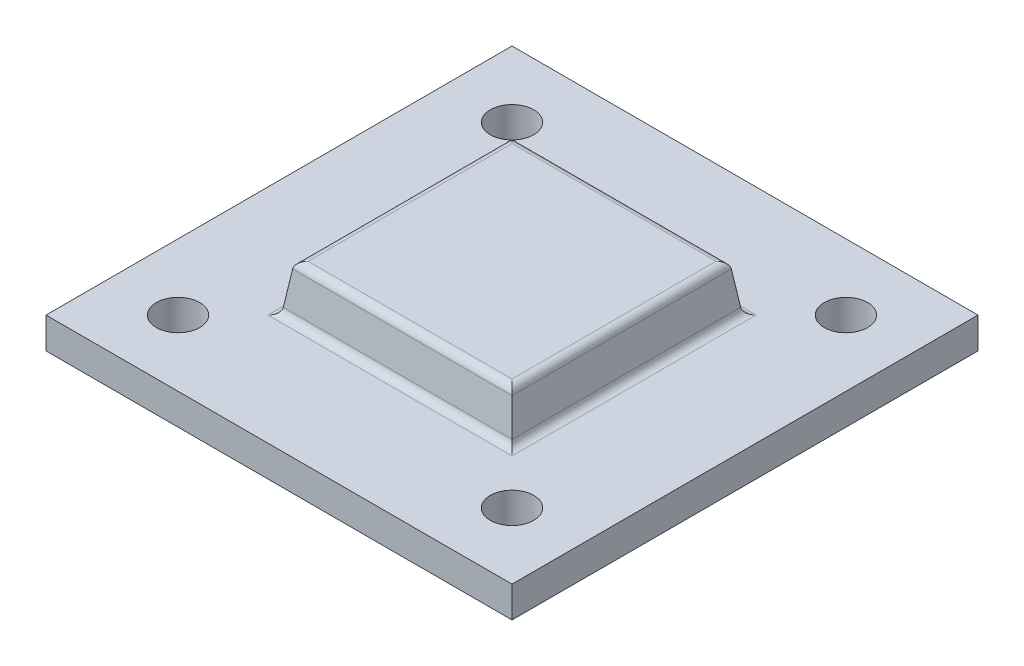
ISO-10303-21;
HEADER;
FILE_DESCRIPTION(('STEP AP214'),'2;1');
FILE_NAME('part.step','',(''),(''),'','','');
FILE_SCHEMA(('AUTOMOTIVE_DESIGN { 1 0 10303 214 1 1 1 1 }'));
ENDSEC;
DATA;
#1=APPLICATION_CONTEXT('core data for automotive mechanical design processes');
#2=APPLICATION_PROTOCOL_DEFINITION('international standard','automotive_design',2000,#1);
#3=PRODUCT_CONTEXT('',#1,'mechanical');
#4=PRODUCT('Part','Part','',(#3));
#5=PRODUCT_RELATED_PRODUCT_CATEGORY('part','',(#4));
#6=PRODUCT_DEFINITION_FORMATION('','',#4);
#7=PRODUCT_DEFINITION_CONTEXT('part definition',#1,'design');
#8=PRODUCT_DEFINITION('design','',#6,#7);
#9=PRODUCT_DEFINITION_SHAPE('','',#8);
#10=(LENGTH_UNIT() NAMED_UNIT(*) SI_UNIT(.MILLI.,.METRE.));
#11=(NAMED_UNIT(*) PLANE_ANGLE_UNIT() SI_UNIT($,.RADIAN.));
#12=(NAMED_UNIT(*) SI_UNIT($,.STERADIAN.) SOLID_ANGLE_UNIT());
#13=UNCERTAINTY_MEASURE_WITH_UNIT(LENGTH_MEASURE(1.E-05),#10,'distance_accuracy_value','');
#14=(GEOMETRIC_REPRESENTATION_CONTEXT(3) GLOBAL_UNCERTAINTY_ASSIGNED_CONTEXT((#13)) GLOBAL_UNIT_ASSIGNED_CONTEXT((#10,
#11,#12)) REPRESENTATION_CONTEXT('',''));
#15=CARTESIAN_POINT('',(0.,0.,0.));
#16=DIRECTION('',(0.,0.,1.));
#17=DIRECTION('',(1.,0.,0.));
#18=AXIS2_PLACEMENT_3D('',#15,#16,#17);
#19=CARTESIAN_POINT('',(0.,4.,0.));
#20=DIRECTION('',(0.,-1.,0.));
#21=DIRECTION('',(0.,0.,-1.));
#22=AXIS2_PLACEMENT_3D('',#19,#20,#21);
#23=PLANE('',#22);
#24=CARTESIAN_POINT('',(-21.5,4.,21.5));
#25=DIRECTION('',(0.,1.,0.));
#26=DIRECTION('',(0.,0.,-1.));
#27=AXIS2_PLACEMENT_3D('',#24,#25,#26);
#28=CIRCLE('',#27,2.794);
#29=CARTESIAN_POINT('',(-21.5,4.,18.706));
#30=VERTEX_POINT('',#29);
#31=EDGE_CURVE('E443',#30,#30,#28,.T.);
#32=ORIENTED_EDGE('',*,*,#31,.F.);
#33=EDGE_LOOP('',(#32));
#34=FACE_BOUND('',#33,.T.);
#35=CARTESIAN_POINT('',(21.5,4.,21.5));
#36=DIRECTION('',(0.,1.,0.));
#37=DIRECTION('',(0.,0.,1.));
#38=AXIS2_PLACEMENT_3D('',#35,#36,#37);
#39=CIRCLE('',#38,2.794);
#40=CARTESIAN_POINT('',(21.5,4.,24.294));
#41=VERTEX_POINT('',#40);
#42=EDGE_CURVE('E445',#41,#41,#39,.T.);
#43=ORIENTED_EDGE('',*,*,#42,.F.);
#44=EDGE_LOOP('',(#43));
#45=FACE_BOUND('',#44,.T.);
#46=CARTESIAN_POINT('',(21.5,4.,-21.5));
#47=DIRECTION('',(0.,1.,0.));
#48=DIRECTION('',(0.,0.,-1.));
#49=AXIS2_PLACEMENT_3D('',#46,#47,#48);
#50=CIRCLE('',#49,2.794);
#51=CARTESIAN_POINT('',(21.5,4.,-24.294));
#52=VERTEX_POINT('',#51);
#53=EDGE_CURVE('E472',#52,#52,#50,.T.);
#54=ORIENTED_EDGE('',*,*,#53,.F.);
#55=EDGE_LOOP('',(#54));
#56=FACE_BOUND('',#55,.T.);
#57=CARTESIAN_POINT('',(-21.5,4.,-21.5));
#58=DIRECTION('',(0.,1.,0.));
#59=DIRECTION('',(0.,0.,1.));
#60=AXIS2_PLACEMENT_3D('',#57,#58,#59);
#61=CIRCLE('',#60,2.794);
#62=CARTESIAN_POINT('',(-21.5,4.,-18.706));
#63=VERTEX_POINT('',#62);
#64=EDGE_CURVE('E451',#63,#63,#61,.T.);
#65=ORIENTED_EDGE('',*,*,#64,.F.);
#66=EDGE_LOOP('',(#65));
#67=FACE_BOUND('',#66,.T.);
#68=DIRECTION('',(0.,0.,1.));
#69=VECTOR('',#68,1.);
#70=CARTESIAN_POINT('',(15.7125317460306,4.,14.8432450082144));
#71=LINE('',#70,#69);
#72=CARTESIAN_POINT('',(15.7125317460306,4.,-15.7125317460306));
#73=VERTEX_POINT('',#72);
#74=CARTESIAN_POINT('',(15.7125317460306,4.,15.7125317460306));
#75=VERTEX_POINT('',#74);
#76=EDGE_CURVE('E196',#73,#75,#71,.T.);
#77=ORIENTED_EDGE('',*,*,#76,.T.);
#78=DIRECTION('',(-1.,0.,0.));
#79=VECTOR('',#78,1.);
#80=CARTESIAN_POINT('',(-14.8432450082144,4.,15.7125317460306));
#81=LINE('',#80,#79);
#82=CARTESIAN_POINT('',(-15.7125317460306,4.,15.7125317460306));
#83=VERTEX_POINT('',#82);
#84=EDGE_CURVE('E11',#75,#83,#81,.T.);
#85=ORIENTED_EDGE('',*,*,#84,.T.);
#86=DIRECTION('',(0.,0.,-1.));
#87=VECTOR('',#86,1.);
#88=CARTESIAN_POINT('',(-15.7125317460306,4.,-14.8432450082143));
#89=LINE('',#88,#87);
#90=CARTESIAN_POINT('',(-15.7125317460306,4.,-15.7125317460306));
#91=VERTEX_POINT('',#90);
#92=EDGE_CURVE('E45',#83,#91,#89,.T.);
#93=ORIENTED_EDGE('',*,*,#92,.T.);
#94=DIRECTION('',(1.,0.,0.));
#95=VECTOR('',#94,1.);
#96=CARTESIAN_POINT('',(14.8432450082143,4.,-15.7125317460306));
#97=LINE('',#96,#95);
#98=EDGE_CURVE('E198',#91,#73,#97,.T.);
#99=ORIENTED_EDGE('',*,*,#98,.T.);
#100=EDGE_LOOP('',(#77,#85,#93,#99));
#101=FACE_BOUND('',#100,.T.);
#102=DIRECTION('',(0.,0.,-1.));
#103=VECTOR('',#102,1.);
#104=CARTESIAN_POINT('',(30.,4.,30.));
#105=LINE('',#104,#103);
#106=CARTESIAN_POINT('',(30.,4.,30.));
#107=VERTEX_POINT('',#106);
#108=CARTESIAN_POINT('',(30.,4.,-30.));
#109=VERTEX_POINT('',#108);
#110=EDGE_CURVE('E138',#107,#109,#105,.T.);
#111=ORIENTED_EDGE('',*,*,#110,.T.);
#112=DIRECTION('',(-1.,0.,0.));
#113=VECTOR('',#112,1.);
#114=CARTESIAN_POINT('',(-30.,4.,-30.));
#115=LINE('',#114,#113);
#116=CARTESIAN_POINT('',(-30.,4.,-30.));
#117=VERTEX_POINT('',#116);
#118=EDGE_CURVE('E127',#109,#117,#115,.T.);
#119=ORIENTED_EDGE('',*,*,#118,.T.);
#120=DIRECTION('',(0.,0.,1.));
#121=VECTOR('',#120,1.);
#122=CARTESIAN_POINT('',(-30.,4.,30.));
#123=LINE('',#122,#121);
#124=CARTESIAN_POINT('',(-30.,4.,30.));
#125=VERTEX_POINT('',#124);
#126=EDGE_CURVE('E137',#117,#125,#123,.T.);
#127=ORIENTED_EDGE('',*,*,#126,.T.);
#128=DIRECTION('',(1.,0.,0.));
#129=VECTOR('',#128,1.);
#130=CARTESIAN_POINT('',(-30.,4.,30.));
#131=LINE('',#130,#129);
#132=EDGE_CURVE('E142',#125,#107,#131,.T.);
#133=ORIENTED_EDGE('',*,*,#132,.T.);
#134=EDGE_LOOP('',(#111,#119,#127,#133));
#135=FACE_BOUND('',#134,.T.);
#136=ADVANCED_FACE('F36',(#34,#45,#56,#67,#101,#135),#23,.F.);
#137=CARTESIAN_POINT('',(30.,4.,30.));
#138=DIRECTION('',(-1.,0.,0.));
#139=DIRECTION('',(0.,0.,1.));
#140=AXIS2_PLACEMENT_3D('',#137,#138,#139);
#141=PLANE('',#140);
#142=DIRECTION('',(0.,0.,-1.));
#143=VECTOR('',#142,1.);
#144=CARTESIAN_POINT('',(30.,0.,30.));
#145=LINE('',#144,#143);
#146=CARTESIAN_POINT('',(30.,0.,30.));
#147=VERTEX_POINT('',#146);
#148=CARTESIAN_POINT('',(30.,0.,-30.));
#149=VERTEX_POINT('',#148);
#150=EDGE_CURVE('E150',#147,#149,#145,.T.);
#151=ORIENTED_EDGE('',*,*,#150,.T.);
#152=DIRECTION('',(0.,-1.,0.));
#153=VECTOR('',#152,1.);
#154=CARTESIAN_POINT('',(30.,4.,-30.));
#155=LINE('',#154,#153);
#156=EDGE_CURVE('E131',#109,#149,#155,.T.);
#157=ORIENTED_EDGE('',*,*,#156,.F.);
#158=ORIENTED_EDGE('',*,*,#110,.F.);
#159=DIRECTION('',(0.,-1.,0.));
#160=VECTOR('',#159,1.);
#161=CARTESIAN_POINT('',(30.,4.,30.));
#162=LINE('',#161,#160);
#163=EDGE_CURVE('E457',#107,#147,#162,.T.);
#164=ORIENTED_EDGE('',*,*,#163,.T.);
#165=EDGE_LOOP('',(#151,#157,#158,#164));
#166=FACE_BOUND('',#165,.T.);
#167=ADVANCED_FACE('F148',(#166),#141,.F.);
#168=CARTESIAN_POINT('',(-30.,4.,-30.));
#169=DIRECTION('',(0.,0.,1.));
#170=DIRECTION('',(1.,0.,0.));
#171=AXIS2_PLACEMENT_3D('',#168,#169,#170);
#172=PLANE('',#171);
#173=DIRECTION('',(-1.,0.,0.));
#174=VECTOR('',#173,1.);
#175=CARTESIAN_POINT('',(-30.,0.,-30.));
#176=LINE('',#175,#174);
#177=CARTESIAN_POINT('',(-30.,0.,-30.));
#178=VERTEX_POINT('',#177);
#179=EDGE_CURVE('E459',#149,#178,#176,.T.);
#180=ORIENTED_EDGE('',*,*,#179,.T.);
#181=DIRECTION('',(0.,-1.,0.));
#182=VECTOR('',#181,1.);
#183=CARTESIAN_POINT('',(-30.,4.,-30.));
#184=LINE('',#183,#182);
#185=EDGE_CURVE('E134',#117,#178,#184,.T.);
#186=ORIENTED_EDGE('',*,*,#185,.F.);
#187=ORIENTED_EDGE('',*,*,#118,.F.);
#188=ORIENTED_EDGE('',*,*,#156,.T.);
#189=EDGE_LOOP('',(#180,#186,#187,#188));
#190=FACE_BOUND('',#189,.T.);
#191=ADVANCED_FACE('F129',(#190),#172,.F.);
#192=CARTESIAN_POINT('',(-30.,4.,30.));
#193=DIRECTION('',(1.,0.,0.));
#194=DIRECTION('',(0.,0.,-1.));
#195=AXIS2_PLACEMENT_3D('',#192,#193,#194);
#196=PLANE('',#195);
#197=DIRECTION('',(0.,0.,1.));
#198=VECTOR('',#197,1.);
#199=CARTESIAN_POINT('',(-30.,0.,30.));
#200=LINE('',#199,#198);
#201=CARTESIAN_POINT('',(-30.,0.,30.));
#202=VERTEX_POINT('',#201);
#203=EDGE_CURVE('E461',#178,#202,#200,.T.);
#204=ORIENTED_EDGE('',*,*,#203,.T.);
#205=DIRECTION('',(0.,-1.,0.));
#206=VECTOR('',#205,1.);
#207=CARTESIAN_POINT('',(-30.,4.,30.));
#208=LINE('',#207,#206);
#209=EDGE_CURVE('E155',#125,#202,#208,.T.);
#210=ORIENTED_EDGE('',*,*,#209,.F.);
#211=ORIENTED_EDGE('',*,*,#126,.F.);
#212=ORIENTED_EDGE('',*,*,#185,.T.);
#213=EDGE_LOOP('',(#204,#210,#211,#212));
#214=FACE_BOUND('',#213,.T.);
#215=ADVANCED_FACE('F289',(#214),#196,.F.);
#216=CARTESIAN_POINT('',(-30.,4.,30.));
#217=DIRECTION('',(0.,0.,-1.));
#218=DIRECTION('',(-1.,0.,0.));
#219=AXIS2_PLACEMENT_3D('',#216,#217,#218);
#220=PLANE('',#219);
#221=DIRECTION('',(1.,0.,0.));
#222=VECTOR('',#221,1.);
#223=CARTESIAN_POINT('',(-30.,0.,30.));
#224=LINE('',#223,#222);
#225=EDGE_CURVE('E146',#202,#147,#224,.T.);
#226=ORIENTED_EDGE('',*,*,#225,.T.);
#227=ORIENTED_EDGE('',*,*,#163,.F.);
#228=ORIENTED_EDGE('',*,*,#132,.F.);
#229=ORIENTED_EDGE('',*,*,#209,.T.);
#230=EDGE_LOOP('',(#226,#227,#228,#229));
#231=FACE_BOUND('',#230,.T.);
#232=ADVANCED_FACE('F285',(#231),#220,.F.);
#233=CARTESIAN_POINT('',(0.,0.,0.));
#234=DIRECTION('',(0.,-1.,0.));
#235=DIRECTION('',(0.,0.,-1.));
#236=AXIS2_PLACEMENT_3D('',#233,#234,#235);
#237=PLANE('',#236);
#238=CARTESIAN_POINT('',(-21.5,0.,21.5));
#239=DIRECTION('',(0.,1.,0.));
#240=DIRECTION('',(0.,0.,-1.));
#241=AXIS2_PLACEMENT_3D('',#238,#239,#240);
#242=CIRCLE('',#241,2.794);
#243=CARTESIAN_POINT('',(-21.5,0.,18.706));
#244=VERTEX_POINT('',#243);
#245=EDGE_CURVE('E441',#244,#244,#242,.T.);
#246=ORIENTED_EDGE('',*,*,#245,.T.);
#247=EDGE_LOOP('',(#246));
#248=FACE_BOUND('',#247,.T.);
#249=CARTESIAN_POINT('',(21.5,0.,21.5));
#250=DIRECTION('',(0.,1.,0.));
#251=DIRECTION('',(0.,0.,1.));
#252=AXIS2_PLACEMENT_3D('',#249,#250,#251);
#253=CIRCLE('',#252,2.794);
#254=CARTESIAN_POINT('',(21.5,0.,24.294));
#255=VERTEX_POINT('',#254);
#256=EDGE_CURVE('E477',#255,#255,#253,.T.);
#257=ORIENTED_EDGE('',*,*,#256,.T.);
#258=EDGE_LOOP('',(#257));
#259=FACE_BOUND('',#258,.T.);
#260=CARTESIAN_POINT('',(21.5,0.,-21.5));
#261=DIRECTION('',(0.,1.,0.));
#262=DIRECTION('',(0.,0.,-1.));
#263=AXIS2_PLACEMENT_3D('',#260,#261,#262);
#264=CIRCLE('',#263,2.794);
#265=CARTESIAN_POINT('',(21.5,0.,-24.294));
#266=VERTEX_POINT('',#265);
#267=EDGE_CURVE('E453',#266,#266,#264,.T.);
#268=ORIENTED_EDGE('',*,*,#267,.T.);
#269=EDGE_LOOP('',(#268));
#270=FACE_BOUND('',#269,.T.);
#271=CARTESIAN_POINT('',(-21.5,0.,-21.5));
#272=DIRECTION('',(0.,1.,0.));
#273=DIRECTION('',(0.,0.,1.));
#274=AXIS2_PLACEMENT_3D('',#271,#272,#273);
#275=CIRCLE('',#274,2.794);
#276=CARTESIAN_POINT('',(-21.5,0.,-18.706));
#277=VERTEX_POINT('',#276);
#278=EDGE_CURVE('E212',#277,#277,#275,.T.);
#279=ORIENTED_EDGE('',*,*,#278,.T.);
#280=EDGE_LOOP('',(#279));
#281=FACE_BOUND('',#280,.T.);
#282=ORIENTED_EDGE('',*,*,#150,.F.);
#283=ORIENTED_EDGE('',*,*,#225,.F.);
#284=ORIENTED_EDGE('',*,*,#203,.F.);
#285=ORIENTED_EDGE('',*,*,#179,.F.);
#286=EDGE_LOOP('',(#282,#283,#284,#285));
#287=FACE_BOUND('',#286,.T.);
#288=ADVANCED_FACE('F282',(#248,#259,#270,#281,#287),#237,.T.);
#289=CARTESIAN_POINT('',(14.,10.,14.));
#290=DIRECTION('',(0.99026806874157,0.139173100960066,0.));
#291=DIRECTION('',(-0.139173100960066,0.99026806874157,0.));
#292=AXIS2_PLACEMENT_3D('',#289,#290,#291);
#293=PLANE('',#292);
#294=DIRECTION('',(0.137844537491629,-0.980814848463989,-0.137844537491629));
#295=VECTOR('',#294,1.);
#296=CARTESIAN_POINT('',(13.4679687375441,13.7855991362403,-13.4679687375441));
#297=LINE('',#296,#295);
#298=CARTESIAN_POINT('',(14.1209813309253,9.13917310096007,-14.1209813309253));
#299=VERTEX_POINT('',#298);
#300=CARTESIAN_POINT('',(14.722263677289,4.86082689903994,-14.722263677289));
#301=VERTEX_POINT('',#300);
#302=EDGE_CURVE('E166',#299,#301,#297,.T.);
#303=ORIENTED_EDGE('',*,*,#302,.F.);
#304=DIRECTION('',(0.,0.,-1.));
#305=VECTOR('',#304,1.);
#306=CARTESIAN_POINT('',(14.1209813309253,9.13917310096007,14.));
#307=LINE('',#306,#305);
#308=CARTESIAN_POINT('',(14.1209813309253,9.13917310096007,14.1209813309253));
#309=VERTEX_POINT('',#308);
#310=EDGE_CURVE('E194',#299,#309,#307,.F.);
#311=ORIENTED_EDGE('',*,*,#310,.T.);
#312=DIRECTION('',(0.137844537491629,-0.980814848463989,0.137844537491629));
#313=VECTOR('',#312,1.);
#314=CARTESIAN_POINT('',(14.,10.,14.));
#315=LINE('',#314,#313);
#316=CARTESIAN_POINT('',(14.722263677289,4.86082689903994,14.722263677289));
#317=VERTEX_POINT('',#316);
#318=EDGE_CURVE('E163',#309,#317,#315,.T.);
#319=ORIENTED_EDGE('',*,*,#318,.T.);
#320=DIRECTION('',(0.,0.,-1.));
#321=VECTOR('',#320,1.);
#322=CARTESIAN_POINT('',(14.722263677289,4.86082689903994,-14.8432450082143));
#323=LINE('',#322,#321);
#324=EDGE_CURVE('E192',#317,#301,#323,.T.);
#325=ORIENTED_EDGE('',*,*,#324,.T.);
#326=EDGE_LOOP('',(#303,#311,#319,#325));
#327=FACE_BOUND('',#326,.T.);
#328=ADVANCED_FACE('F236',(#327),#293,.T.);
#329=CARTESIAN_POINT('',(-14.,10.,-14.));
#330=DIRECTION('',(0.,0.139173100960066,-0.99026806874157));
#331=DIRECTION('',(0.,0.99026806874157,0.139173100960066));
#332=AXIS2_PLACEMENT_3D('',#329,#330,#331);
#333=PLANE('',#332);
#334=DIRECTION('',(-0.137844537491629,-0.980814848463989,-0.137844537491629));
#335=VECTOR('',#334,1.);
#336=CARTESIAN_POINT('',(-13.4679687375441,13.7855991362403,-13.4679687375441));
#337=LINE('',#336,#335);
#338=CARTESIAN_POINT('',(-14.1209813309253,9.13917310096007,-14.1209813309253));
#339=VERTEX_POINT('',#338);
#340=CARTESIAN_POINT('',(-14.722263677289,4.86082689903994,-14.722263677289));
#341=VERTEX_POINT('',#340);
#342=EDGE_CURVE('E162',#339,#341,#337,.T.);
#343=ORIENTED_EDGE('',*,*,#342,.F.);
#344=DIRECTION('',(-1.,0.,0.));
#345=VECTOR('',#344,1.);
#346=CARTESIAN_POINT('',(-14.,9.13917310096007,-14.1209813309253));
#347=LINE('',#346,#345);
#348=EDGE_CURVE('E190',#339,#299,#347,.F.);
#349=ORIENTED_EDGE('',*,*,#348,.T.);
#350=ORIENTED_EDGE('',*,*,#302,.T.);
#351=DIRECTION('',(-1.,0.,0.));
#352=VECTOR('',#351,1.);
#353=CARTESIAN_POINT('',(-14.8432450082144,4.86082689903994,-14.722263677289));
#354=LINE('',#353,#352);
#355=EDGE_CURVE('E188',#301,#341,#354,.T.);
#356=ORIENTED_EDGE('',*,*,#355,.T.);
#357=EDGE_LOOP('',(#343,#349,#350,#356));
#358=FACE_BOUND('',#357,.T.);
#359=ADVANCED_FACE('F253',(#358),#333,.T.);
#360=CARTESIAN_POINT('',(-14.,10.,14.));
#361=DIRECTION('',(-0.99026806874157,0.139173100960066,0.));
#362=DIRECTION('',(-0.139173100960066,-0.99026806874157,0.));
#363=AXIS2_PLACEMENT_3D('',#360,#361,#362);
#364=PLANE('',#363);
#365=DIRECTION('',(-0.137844537491629,-0.980814848463989,0.137844537491629));
#366=VECTOR('',#365,1.);
#367=CARTESIAN_POINT('',(-14.,10.,14.));
#368=LINE('',#367,#366);
#369=CARTESIAN_POINT('',(-14.1209813309253,9.13917310096007,14.1209813309253));
#370=VERTEX_POINT('',#369);
#371=CARTESIAN_POINT('',(-14.722263677289,4.86082689903994,14.722263677289));
#372=VERTEX_POINT('',#371);
#373=EDGE_CURVE('E159',#370,#372,#368,.T.);
#374=ORIENTED_EDGE('',*,*,#373,.F.);
#375=DIRECTION('',(0.,0.,1.));
#376=VECTOR('',#375,1.);
#377=CARTESIAN_POINT('',(-14.1209813309253,9.13917310096007,14.));
#378=LINE('',#377,#376);
#379=EDGE_CURVE('E186',#370,#339,#378,.F.);
#380=ORIENTED_EDGE('',*,*,#379,.T.);
#381=ORIENTED_EDGE('',*,*,#342,.T.);
#382=DIRECTION('',(0.,0.,1.));
#383=VECTOR('',#382,1.);
#384=CARTESIAN_POINT('',(-14.722263677289,4.86082689903994,14.8432450082144));
#385=LINE('',#384,#383);
#386=EDGE_CURVE('E184',#341,#372,#385,.T.);
#387=ORIENTED_EDGE('',*,*,#386,.T.);
#388=EDGE_LOOP('',(#374,#380,#381,#387));
#389=FACE_BOUND('',#388,.T.);
#390=ADVANCED_FACE('F249',(#389),#364,.T.);
#391=CARTESIAN_POINT('',(-14.,10.,14.));
#392=DIRECTION('',(0.,0.139173100960066,0.99026806874157));
#393=DIRECTION('',(0.,-0.99026806874157,0.139173100960066));
#394=AXIS2_PLACEMENT_3D('',#391,#392,#393);
#395=PLANE('',#394);
#396=ORIENTED_EDGE('',*,*,#318,.F.);
#397=DIRECTION('',(1.,0.,0.));
#398=VECTOR('',#397,1.);
#399=CARTESIAN_POINT('',(-14.,9.13917310096007,14.1209813309253));
#400=LINE('',#399,#398);
#401=EDGE_CURVE('E181',#309,#370,#400,.F.);
#402=ORIENTED_EDGE('',*,*,#401,.T.);
#403=ORIENTED_EDGE('',*,*,#373,.T.);
#404=DIRECTION('',(1.,0.,0.));
#405=VECTOR('',#404,1.);
#406=CARTESIAN_POINT('',(14.8432450082143,4.86082689903994,14.722263677289));
#407=LINE('',#406,#405);
#408=EDGE_CURVE('E178',#372,#317,#407,.T.);
#409=ORIENTED_EDGE('',*,*,#408,.T.);
#410=EDGE_LOOP('',(#396,#402,#403,#409));
#411=FACE_BOUND('',#410,.T.);
#412=ADVANCED_FACE('F233',(#411),#395,.T.);
#413=CARTESIAN_POINT('',(0.,10.,0.));
#414=DIRECTION('',(0.,-1.,0.));
#415=DIRECTION('',(0.,0.,-1.));
#416=AXIS2_PLACEMENT_3D('',#413,#414,#415);
#417=PLANE('',#416);
#418=DIRECTION('',(0.,0.,-1.));
#419=VECTOR('',#418,1.);
#420=CARTESIAN_POINT('',(-13.1307132621838,10.,0.));
#421=LINE('',#420,#419);
#422=CARTESIAN_POINT('',(-13.1307132621838,10.,-13.1307132621838));
#423=VERTEX_POINT('',#422);
#424=CARTESIAN_POINT('',(-13.1307132621838,10.,13.1307132621838));
#425=VERTEX_POINT('',#424);
#426=EDGE_CURVE('E173',#423,#425,#421,.F.);
#427=ORIENTED_EDGE('',*,*,#426,.T.);
#428=DIRECTION('',(-1.,0.,0.));
#429=VECTOR('',#428,1.);
#430=CARTESIAN_POINT('',(0.,10.,13.1307132621838));
#431=LINE('',#430,#429);
#432=CARTESIAN_POINT('',(13.1307132621838,10.,13.1307132621838));
#433=VERTEX_POINT('',#432);
#434=EDGE_CURVE('E175',#425,#433,#431,.F.);
#435=ORIENTED_EDGE('',*,*,#434,.T.);
#436=DIRECTION('',(0.,0.,1.));
#437=VECTOR('',#436,1.);
#438=CARTESIAN_POINT('',(13.1307132621838,10.,0.));
#439=LINE('',#438,#437);
#440=CARTESIAN_POINT('',(13.1307132621838,10.,-13.1307132621838));
#441=VERTEX_POINT('',#440);
#442=EDGE_CURVE('E151',#433,#441,#439,.F.);
#443=ORIENTED_EDGE('',*,*,#442,.T.);
#444=DIRECTION('',(1.,0.,0.));
#445=VECTOR('',#444,1.);
#446=CARTESIAN_POINT('',(0.,10.,-13.1307132621838));
#447=LINE('',#446,#445);
#448=EDGE_CURVE('E153',#441,#423,#447,.F.);
#449=ORIENTED_EDGE('',*,*,#448,.T.);
#450=EDGE_LOOP('',(#427,#435,#443,#449));
#451=FACE_BOUND('',#450,.T.);
#452=ADVANCED_FACE('F262',(#451),#417,.F.);
#453=CARTESIAN_POINT('',(0.,9.,-13.1307132621838));
#454=DIRECTION('',(1.,0.,0.));
#455=DIRECTION('',(0.,0.,-1.));
#456=AXIS2_PLACEMENT_3D('',#453,#454,#455);
#457=CYLINDRICAL_SURFACE('',#456,1.);
#458=CARTESIAN_POINT('',(13.1307132621838,9.,-13.1307132621838));
#459=DIRECTION('',(0.707106781186547,0.,0.707106781186547));
#460=DIRECTION('',(-0.707106781186547,0.,0.707106781186547));
#461=AXIS2_PLACEMENT_3D('',#458,#459,#460);
#462=ELLIPSE('',#461,1.41421356237309,1.);
#463=EDGE_CURVE('E205',#299,#441,#462,.T.);
#464=ORIENTED_EDGE('',*,*,#463,.F.);
#465=ORIENTED_EDGE('',*,*,#348,.F.);
#466=CARTESIAN_POINT('',(-13.1307132621838,9.,-13.1307132621838));
#467=DIRECTION('',(0.707106781186547,0.,-0.707106781186547));
#468=DIRECTION('',(0.707106781186547,0.,0.707106781186547));
#469=AXIS2_PLACEMENT_3D('',#466,#467,#468);
#470=ELLIPSE('',#469,1.41421356237309,1.);
#471=EDGE_CURVE('E170',#423,#339,#470,.F.);
#472=ORIENTED_EDGE('',*,*,#471,.F.);
#473=ORIENTED_EDGE('',*,*,#448,.F.);
#474=EDGE_LOOP('',(#464,#465,#472,#473));
#475=FACE_BOUND('',#474,.T.);
#476=ADVANCED_FACE('F256',(#475),#457,.T.);
#477=CARTESIAN_POINT('',(-13.1307132621838,9.,0.));
#478=DIRECTION('',(0.,0.,-1.));
#479=DIRECTION('',(-1.,0.,0.));
#480=AXIS2_PLACEMENT_3D('',#477,#478,#479);
#481=CYLINDRICAL_SURFACE('',#480,1.);
#482=ORIENTED_EDGE('',*,*,#471,.T.);
#483=ORIENTED_EDGE('',*,*,#379,.F.);
#484=CARTESIAN_POINT('',(-13.1307132621838,9.,13.1307132621838));
#485=DIRECTION('',(-0.707106781186547,0.,-0.707106781186547));
#486=DIRECTION('',(0.707106781186547,0.,-0.707106781186547));
#487=AXIS2_PLACEMENT_3D('',#484,#485,#486);
#488=ELLIPSE('',#487,1.41421356237309,1.);
#489=EDGE_CURVE('E203',#425,#370,#488,.F.);
#490=ORIENTED_EDGE('',*,*,#489,.F.);
#491=ORIENTED_EDGE('',*,*,#426,.F.);
#492=EDGE_LOOP('',(#482,#483,#490,#491));
#493=FACE_BOUND('',#492,.T.);
#494=ADVANCED_FACE('F260',(#493),#481,.T.);
#495=CARTESIAN_POINT('',(13.1307132621838,9.,0.));
#496=DIRECTION('',(0.,0.,1.));
#497=DIRECTION('',(1.,0.,0.));
#498=AXIS2_PLACEMENT_3D('',#495,#496,#497);
#499=CYLINDRICAL_SURFACE('',#498,1.);
#500=ORIENTED_EDGE('',*,*,#463,.T.);
#501=ORIENTED_EDGE('',*,*,#442,.F.);
#502=CARTESIAN_POINT('',(13.1307132621838,9.,13.1307132621838));
#503=DIRECTION('',(-0.707106781186547,0.,0.707106781186547));
#504=DIRECTION('',(0.707106781186547,0.,0.707106781186547));
#505=AXIS2_PLACEMENT_3D('',#502,#503,#504);
#506=ELLIPSE('',#505,1.41421356237309,1.);
#507=EDGE_CURVE('E201',#309,#433,#506,.T.);
#508=ORIENTED_EDGE('',*,*,#507,.F.);
#509=ORIENTED_EDGE('',*,*,#310,.F.);
#510=EDGE_LOOP('',(#500,#501,#508,#509));
#511=FACE_BOUND('',#510,.T.);
#512=ADVANCED_FACE('F241',(#511),#499,.T.);
#513=CARTESIAN_POINT('',(0.,9.,13.1307132621838));
#514=DIRECTION('',(-1.,0.,0.));
#515=DIRECTION('',(0.,0.,1.));
#516=AXIS2_PLACEMENT_3D('',#513,#514,#515);
#517=CYLINDRICAL_SURFACE('',#516,1.);
#518=ORIENTED_EDGE('',*,*,#489,.T.);
#519=ORIENTED_EDGE('',*,*,#401,.F.);
#520=ORIENTED_EDGE('',*,*,#507,.T.);
#521=ORIENTED_EDGE('',*,*,#434,.F.);
#522=EDGE_LOOP('',(#518,#519,#520,#521));
#523=FACE_BOUND('',#522,.T.);
#524=ADVANCED_FACE('F245',(#523),#517,.T.);
#525=CARTESIAN_POINT('',(-14.,5.,-15.7125317460306));
#526=DIRECTION('',(-1.,0.,0.));
#527=DIRECTION('',(0.,0.,1.));
#528=AXIS2_PLACEMENT_3D('',#525,#526,#527);
#529=CYLINDRICAL_SURFACE('',#528,1.);
#530=CARTESIAN_POINT('',(15.7125317460306,5.,-15.7125317460306));
#531=DIRECTION('',(-0.707106781186547,0.,-0.707106781186547));
#532=DIRECTION('',(0.707106781186547,0.,-0.707106781186547));
#533=AXIS2_PLACEMENT_3D('',#530,#531,#532);
#534=ELLIPSE('',#533,1.41421356237309,1.);
#535=EDGE_CURVE('E213',#73,#301,#534,.T.);
#536=ORIENTED_EDGE('',*,*,#535,.F.);
#537=ORIENTED_EDGE('',*,*,#98,.F.);
#538=CARTESIAN_POINT('',(-15.7125317460306,5.,-15.7125317460306));
#539=DIRECTION('',(-0.707106781186547,0.,0.707106781186547));
#540=DIRECTION('',(-0.707106781186547,0.,-0.707106781186547));
#541=AXIS2_PLACEMENT_3D('',#538,#539,#540);
#542=ELLIPSE('',#541,1.41421356237309,1.);
#543=EDGE_CURVE('E40',#341,#91,#542,.F.);
#544=ORIENTED_EDGE('',*,*,#543,.F.);
#545=ORIENTED_EDGE('',*,*,#355,.F.);
#546=EDGE_LOOP('',(#536,#537,#544,#545));
#547=FACE_BOUND('',#546,.T.);
#548=ADVANCED_FACE('F38',(#547),#529,.F.);
#549=CARTESIAN_POINT('',(-15.7125317460306,5.,14.));
#550=DIRECTION('',(0.,0.,1.));
#551=DIRECTION('',(1.,0.,0.));
#552=AXIS2_PLACEMENT_3D('',#549,#550,#551);
#553=CYLINDRICAL_SURFACE('',#552,1.);
#554=ORIENTED_EDGE('',*,*,#543,.T.);
#555=ORIENTED_EDGE('',*,*,#92,.F.);
#556=CARTESIAN_POINT('',(-15.7125317460306,5.,15.7125317460306));
#557=DIRECTION('',(0.707106781186547,0.,0.707106781186547));
#558=DIRECTION('',(-0.707106781186547,0.,0.707106781186547));
#559=AXIS2_PLACEMENT_3D('',#556,#557,#558);
#560=ELLIPSE('',#559,1.41421356237309,1.);
#561=EDGE_CURVE('E53',#372,#83,#560,.F.);
#562=ORIENTED_EDGE('',*,*,#561,.F.);
#563=ORIENTED_EDGE('',*,*,#386,.F.);
#564=EDGE_LOOP('',(#554,#555,#562,#563));
#565=FACE_BOUND('',#564,.T.);
#566=ADVANCED_FACE('F223',(#565),#553,.F.);
#567=CARTESIAN_POINT('',(15.7125317460306,5.,14.));
#568=DIRECTION('',(0.,0.,-1.));
#569=DIRECTION('',(-1.,0.,0.));
#570=AXIS2_PLACEMENT_3D('',#567,#568,#569);
#571=CYLINDRICAL_SURFACE('',#570,1.);
#572=ORIENTED_EDGE('',*,*,#535,.T.);
#573=ORIENTED_EDGE('',*,*,#324,.F.);
#574=CARTESIAN_POINT('',(15.7125317460306,5.,15.7125317460306));
#575=DIRECTION('',(0.707106781186547,0.,-0.707106781186547));
#576=DIRECTION('',(-0.707106781186547,0.,-0.707106781186547));
#577=AXIS2_PLACEMENT_3D('',#574,#575,#576);
#578=ELLIPSE('',#577,1.41421356237309,1.);
#579=EDGE_CURVE('E210',#75,#317,#578,.T.);
#580=ORIENTED_EDGE('',*,*,#579,.F.);
#581=ORIENTED_EDGE('',*,*,#76,.F.);
#582=EDGE_LOOP('',(#572,#573,#580,#581));
#583=FACE_BOUND('',#582,.T.);
#584=ADVANCED_FACE('F228',(#583),#571,.F.);
#585=CARTESIAN_POINT('',(-14.,5.,15.7125317460306));
#586=DIRECTION('',(1.,0.,0.));
#587=DIRECTION('',(0.,0.,-1.));
#588=AXIS2_PLACEMENT_3D('',#585,#586,#587);
#589=CYLINDRICAL_SURFACE('',#588,1.);
#590=ORIENTED_EDGE('',*,*,#561,.T.);
#591=ORIENTED_EDGE('',*,*,#84,.F.);
#592=ORIENTED_EDGE('',*,*,#579,.T.);
#593=ORIENTED_EDGE('',*,*,#408,.F.);
#594=EDGE_LOOP('',(#590,#591,#592,#593));
#595=FACE_BOUND('',#594,.T.);
#596=ADVANCED_FACE('F227',(#595),#589,.F.);
#597=CARTESIAN_POINT('',(-21.5,0.,-21.5));
#598=DIRECTION('',(0.,1.,0.));
#599=DIRECTION('',(0.,0.,1.));
#600=AXIS2_PLACEMENT_3D('',#597,#598,#599);
#601=CYLINDRICAL_SURFACE('',#600,2.794);
#602=ORIENTED_EDGE('',*,*,#278,.F.);
#603=EDGE_LOOP('',(#602));
#604=FACE_BOUND('',#603,.T.);
#605=ORIENTED_EDGE('',*,*,#64,.T.);
#606=EDGE_LOOP('',(#605));
#607=FACE_BOUND('',#606,.T.);
#608=ADVANCED_FACE('F310',(#604,#607),#601,.F.);
#609=CARTESIAN_POINT('',(21.5,0.,-21.5));
#610=DIRECTION('',(0.,1.,0.));
#611=DIRECTION('',(0.,0.,1.));
#612=AXIS2_PLACEMENT_3D('',#609,#610,#611);
#613=CYLINDRICAL_SURFACE('',#612,2.794);
#614=ORIENTED_EDGE('',*,*,#267,.F.);
#615=EDGE_LOOP('',(#614));
#616=FACE_BOUND('',#615,.T.);
#617=ORIENTED_EDGE('',*,*,#53,.T.);
#618=EDGE_LOOP('',(#617));
#619=FACE_BOUND('',#618,.T.);
#620=ADVANCED_FACE('F404',(#616,#619),#613,.F.);
#621=CARTESIAN_POINT('',(21.5,0.,21.5));
#622=DIRECTION('',(0.,1.,0.));
#623=DIRECTION('',(0.,0.,1.));
#624=AXIS2_PLACEMENT_3D('',#621,#622,#623);
#625=CYLINDRICAL_SURFACE('',#624,2.794);
#626=ORIENTED_EDGE('',*,*,#256,.F.);
#627=EDGE_LOOP('',(#626));
#628=FACE_BOUND('',#627,.T.);
#629=ORIENTED_EDGE('',*,*,#42,.T.);
#630=EDGE_LOOP('',(#629));
#631=FACE_BOUND('',#630,.T.);
#632=ADVANCED_FACE('F414',(#628,#631),#625,.F.);
#633=CARTESIAN_POINT('',(-21.5,0.,21.5));
#634=DIRECTION('',(0.,1.,0.));
#635=DIRECTION('',(0.,0.,1.));
#636=AXIS2_PLACEMENT_3D('',#633,#634,#635);
#637=CYLINDRICAL_SURFACE('',#636,2.794);
#638=ORIENTED_EDGE('',*,*,#245,.F.);
#639=EDGE_LOOP('',(#638));
#640=FACE_BOUND('',#639,.T.);
#641=ORIENTED_EDGE('',*,*,#31,.T.);
#642=EDGE_LOOP('',(#641));
#643=FACE_BOUND('',#642,.T.);
#644=ADVANCED_FACE('F424',(#640,#643),#637,.F.);
#645=CLOSED_SHELL('',(#136,#167,#191,#215,#232,#288,#328,#359,#390,#412,#452,#476,#494,#512,
#524,#548,#566,#584,#596,#608,#620,#632,#644));
#646=MANIFOLD_SOLID_BREP('B2',#645);
#647=ADVANCED_BREP_SHAPE_REPRESENTATION('',(#18,#646),#14);
#648=SHAPE_DEFINITION_REPRESENTATION(#9,#647);
ENDSEC;
END-ISO-10303-21;
